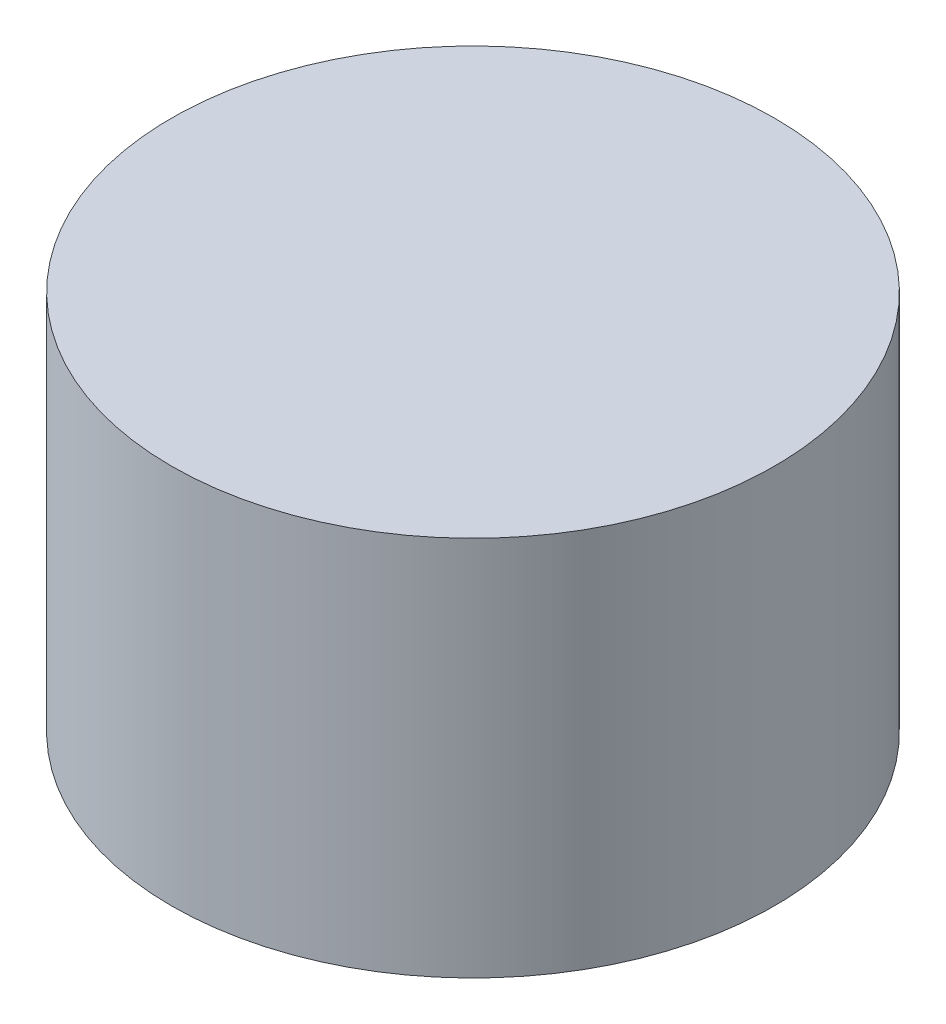
ISO-10303-21;
HEADER;
FILE_DESCRIPTION(('STEP AP214'),'2;1');
FILE_NAME('part.step','',(''),(''),'','','');
FILE_SCHEMA(('AUTOMOTIVE_DESIGN { 1 0 10303 214 1 1 1 1 }'));
ENDSEC;
DATA;
#1=APPLICATION_CONTEXT('core data for automotive mechanical design processes');
#2=APPLICATION_PROTOCOL_DEFINITION('international standard','automotive_design',2000,#1);
#3=PRODUCT_CONTEXT('',#1,'mechanical');
#4=PRODUCT('Part','Part','',(#3));
#5=PRODUCT_RELATED_PRODUCT_CATEGORY('part','',(#4));
#6=PRODUCT_DEFINITION_FORMATION('','',#4);
#7=PRODUCT_DEFINITION_CONTEXT('part definition',#1,'design');
#8=PRODUCT_DEFINITION('design','',#6,#7);
#9=PRODUCT_DEFINITION_SHAPE('','',#8);
#10=(LENGTH_UNIT() NAMED_UNIT(*) SI_UNIT(.MILLI.,.METRE.));
#11=(NAMED_UNIT(*) PLANE_ANGLE_UNIT() SI_UNIT($,.RADIAN.));
#12=(NAMED_UNIT(*) SI_UNIT($,.STERADIAN.) SOLID_ANGLE_UNIT());
#13=UNCERTAINTY_MEASURE_WITH_UNIT(LENGTH_MEASURE(1.E-05),#10,'distance_accuracy_value','');
#14=(GEOMETRIC_REPRESENTATION_CONTEXT(3) GLOBAL_UNCERTAINTY_ASSIGNED_CONTEXT((#13)) GLOBAL_UNIT_ASSIGNED_CONTEXT((#10,
#11,#12)) REPRESENTATION_CONTEXT('',''));
#15=CARTESIAN_POINT('',(0.,0.,0.));
#16=DIRECTION('',(0.,0.,1.));
#17=DIRECTION('',(1.,0.,0.));
#18=AXIS2_PLACEMENT_3D('',#15,#16,#17);
#19=CARTESIAN_POINT('',(0.,-26.4,0.));
#20=DIRECTION('',(0.,1.,0.));
#21=DIRECTION('',(0.,0.,1.));
#22=AXIS2_PLACEMENT_3D('',#19,#20,#21);
#23=CYLINDRICAL_SURFACE('',#22,20.9);
#24=CARTESIAN_POINT('',(0.,-26.4,0.));
#25=DIRECTION('',(0.,1.,0.));
#26=DIRECTION('',(0.,0.,1.));
#27=AXIS2_PLACEMENT_3D('',#24,#25,#26);
#28=CIRCLE('',#27,20.9);
#29=CARTESIAN_POINT('',(0.,-26.4,20.9));
#30=VERTEX_POINT('',#29);
#31=EDGE_CURVE('E10',#30,#30,#28,.T.);
#32=ORIENTED_EDGE('',*,*,#31,.T.);
#33=EDGE_LOOP('',(#32));
#34=FACE_BOUND('',#33,.T.);
#35=CARTESIAN_POINT('',(0.,0.,0.));
#36=DIRECTION('',(0.,1.,0.));
#37=DIRECTION('',(0.,0.,1.));
#38=AXIS2_PLACEMENT_3D('',#35,#36,#37);
#39=CIRCLE('',#38,20.9);
#40=CARTESIAN_POINT('',(0.,0.,20.9));
#41=VERTEX_POINT('',#40);
#42=EDGE_CURVE('E38',#41,#41,#39,.T.);
#43=ORIENTED_EDGE('',*,*,#42,.F.);
#44=EDGE_LOOP('',(#43));
#45=FACE_BOUND('',#44,.T.);
#46=ADVANCED_FACE('F35',(#34,#45),#23,.T.);
#47=CARTESIAN_POINT('',(0.,-26.4,0.));
#48=DIRECTION('',(0.,1.,0.));
#49=DIRECTION('',(0.,0.,1.));
#50=AXIS2_PLACEMENT_3D('',#47,#48,#49);
#51=PLANE('',#50);
#52=ORIENTED_EDGE('',*,*,#31,.F.);
#53=EDGE_LOOP('',(#52));
#54=FACE_BOUND('',#53,.T.);
#55=ADVANCED_FACE('F50',(#54),#51,.F.);
#56=CARTESIAN_POINT('',(0.,0.,0.));
#57=DIRECTION('',(0.,1.,0.));
#58=DIRECTION('',(0.,0.,1.));
#59=AXIS2_PLACEMENT_3D('',#56,#57,#58);
#60=PLANE('',#59);
#61=ORIENTED_EDGE('',*,*,#42,.T.);
#62=EDGE_LOOP('',(#61));
#63=FACE_BOUND('',#62,.T.);
#64=ADVANCED_FACE('F47',(#63),#60,.T.);
#65=CLOSED_SHELL('',(#46,#55,#64));
#66=MANIFOLD_SOLID_BREP('B2',#65);
#67=ADVANCED_BREP_SHAPE_REPRESENTATION('',(#18,#66),#14);
#68=SHAPE_DEFINITION_REPRESENTATION(#9,#67);
ENDSEC;
END-ISO-10303-21;
